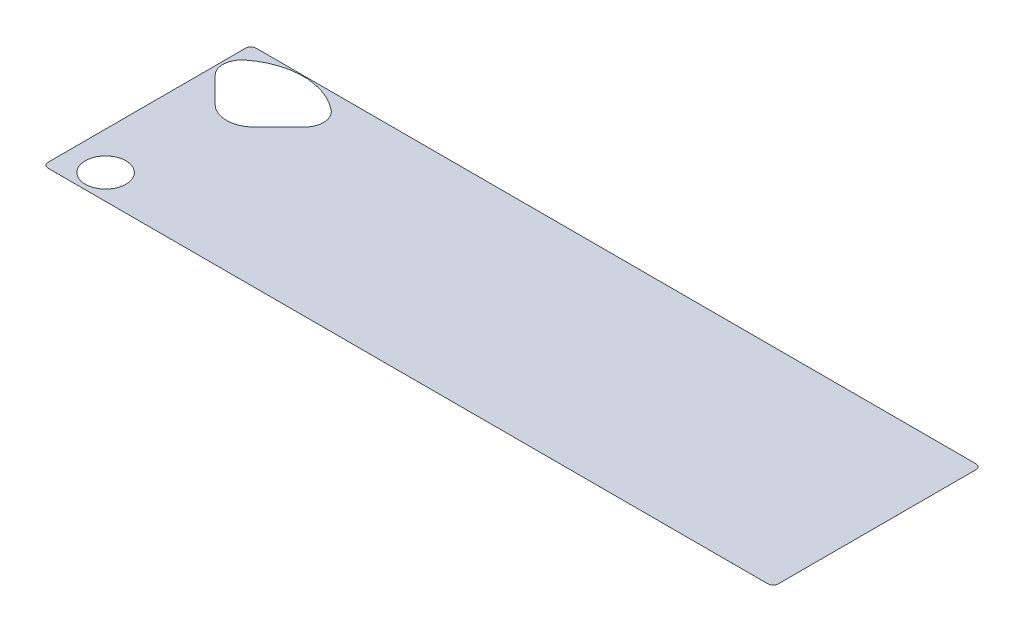
ISO-10303-21;
HEADER;
FILE_DESCRIPTION(('STEP AP214'),'2;1');
FILE_NAME('part.step','',(''),(''),'','','');
FILE_SCHEMA(('AUTOMOTIVE_DESIGN { 1 0 10303 214 1 1 1 1 }'));
ENDSEC;
DATA;
#1=APPLICATION_CONTEXT('core data for automotive mechanical design processes');
#2=APPLICATION_PROTOCOL_DEFINITION('international standard','automotive_design',2000,#1);
#3=PRODUCT_CONTEXT('',#1,'mechanical');
#4=PRODUCT('Part','Part','',(#3));
#5=PRODUCT_RELATED_PRODUCT_CATEGORY('part','',(#4));
#6=PRODUCT_DEFINITION_FORMATION('','',#4);
#7=PRODUCT_DEFINITION_CONTEXT('part definition',#1,'design');
#8=PRODUCT_DEFINITION('design','',#6,#7);
#9=PRODUCT_DEFINITION_SHAPE('','',#8);
#10=(LENGTH_UNIT() NAMED_UNIT(*) SI_UNIT(.MILLI.,.METRE.));
#11=(NAMED_UNIT(*) PLANE_ANGLE_UNIT() SI_UNIT($,.RADIAN.));
#12=(NAMED_UNIT(*) SI_UNIT($,.STERADIAN.) SOLID_ANGLE_UNIT());
#13=UNCERTAINTY_MEASURE_WITH_UNIT(LENGTH_MEASURE(1.E-05),#10,'distance_accuracy_value','');
#14=(GEOMETRIC_REPRESENTATION_CONTEXT(3) GLOBAL_UNCERTAINTY_ASSIGNED_CONTEXT((#13)) GLOBAL_UNIT_ASSIGNED_CONTEXT((#10,
#11,#12)) REPRESENTATION_CONTEXT('',''));
#15=CARTESIAN_POINT('',(0.,0.,0.));
#16=DIRECTION('',(0.,0.,1.));
#17=DIRECTION('',(1.,0.,0.));
#18=AXIS2_PLACEMENT_3D('',#15,#16,#17);
#19=CARTESIAN_POINT('',(-837.635452032068,-122.169,236.036452032068));
#20=DIRECTION('',(0.,-1.,0.));
#21=DIRECTION('',(0.,0.,-1.));
#22=AXIS2_PLACEMENT_3D('',#19,#20,#21);
#23=PLANE('',#22);
#24=DIRECTION('',(0.,0.,1.));
#25=VECTOR('',#24,1.);
#26=CARTESIAN_POINT('',(-841.209630394536,-122.169,-236.036452032068));
#27=LINE('',#26,#25);
#28=CARTESIAN_POINT('',(-841.209630394536,-122.169,-227.338277777606));
#29=VERTEX_POINT('',#28);
#30=CARTESIAN_POINT('',(-841.209630394536,-122.169,227.338277777606));
#31=VERTEX_POINT('',#30);
#32=EDGE_CURVE('E187',#29,#31,#27,.T.);
#33=ORIENTED_EDGE('',*,*,#32,.T.);
#34=CARTESIAN_POINT('',(-841.209630394536,-122.169,227.338277777606));
#35=CARTESIAN_POINT('',(-841.209630394536,-122.169,228.94126290041));
#36=CARTESIAN_POINT('',(-840.578161905761,-122.169,232.191113095237));
#37=CARTESIAN_POINT('',(-837.861109297853,-122.169,236.262109297853));
#38=CARTESIAN_POINT('',(-833.790113095237,-122.169,238.979161905761));
#39=CARTESIAN_POINT('',(-830.540262900411,-122.169,239.610630394536));
#40=CARTESIAN_POINT('',(-828.937277777606,-122.169,239.610630394536));
#41=B_SPLINE_CURVE_WITH_KNOTS('',3,(#34,#35,#36,#37,#38,#39,#40),.UNSPECIFIED.,.F.,.F.,(4,1,1,1,
4),(0.,0.25,0.5,0.75,1.),.UNSPECIFIED.);
#42=CARTESIAN_POINT('',(-828.937277777606,-122.169,239.610630394536));
#43=VERTEX_POINT('',#42);
#44=EDGE_CURVE('E190',#31,#43,#41,.T.);
#45=ORIENTED_EDGE('',*,*,#44,.T.);
#46=DIRECTION('',(1.,0.,0.));
#47=VECTOR('',#46,1.);
#48=CARTESIAN_POINT('',(-837.635452032068,-122.169,239.610630394536));
#49=LINE('',#48,#47);
#50=CARTESIAN_POINT('',(828.937277777606,-122.169,239.610630394536));
#51=VERTEX_POINT('',#50);
#52=EDGE_CURVE('E196',#43,#51,#49,.T.);
#53=ORIENTED_EDGE('',*,*,#52,.T.);
#54=CARTESIAN_POINT('',(828.937277777606,-122.169,239.610630394536));
#55=CARTESIAN_POINT('',(830.54026290041,-122.169,239.610630394536));
#56=CARTESIAN_POINT('',(833.790113095237,-122.169,238.979161905761));
#57=CARTESIAN_POINT('',(837.861109297853,-122.169,236.262109297853));
#58=CARTESIAN_POINT('',(840.57816190576,-122.169,232.191113095237));
#59=CARTESIAN_POINT('',(841.209630394536,-122.169,228.94126290041));
#60=CARTESIAN_POINT('',(841.209630394536,-122.169,227.338277777606));
#61=B_SPLINE_CURVE_WITH_KNOTS('',3,(#54,#55,#56,#57,#58,#59,#60),.UNSPECIFIED.,.F.,.F.,(4,1,1,1,
4),(0.,0.25,0.5,0.75,1.),.UNSPECIFIED.);
#62=CARTESIAN_POINT('',(841.209630394536,-122.169,227.338277777606));
#63=VERTEX_POINT('',#62);
#64=EDGE_CURVE('E215',#51,#63,#61,.T.);
#65=ORIENTED_EDGE('',*,*,#64,.T.);
#66=DIRECTION('',(0.,0.,-1.));
#67=VECTOR('',#66,1.);
#68=CARTESIAN_POINT('',(841.209630394536,-122.169,-236.036452032068));
#69=LINE('',#68,#67);
#70=CARTESIAN_POINT('',(841.209630394536,-122.169,-227.338277777606));
#71=VERTEX_POINT('',#70);
#72=EDGE_CURVE('E220',#63,#71,#69,.T.);
#73=ORIENTED_EDGE('',*,*,#72,.T.);
#74=CARTESIAN_POINT('',(841.209630394536,-122.169,-227.338277777606));
#75=CARTESIAN_POINT('',(841.209630394536,-122.169,-228.94126290041));
#76=CARTESIAN_POINT('',(840.578161905761,-122.169,-232.191113095237));
#77=CARTESIAN_POINT('',(837.861109297853,-122.169,-236.262109297853));
#78=CARTESIAN_POINT('',(833.790113095237,-122.169,-238.979161905761));
#79=CARTESIAN_POINT('',(830.54026290041,-122.169,-239.610630394536));
#80=CARTESIAN_POINT('',(828.937277777606,-122.169,-239.610630394536));
#81=B_SPLINE_CURVE_WITH_KNOTS('',3,(#74,#75,#76,#77,#78,#79,#80),.UNSPECIFIED.,.F.,.F.,(4,1,1,1,
4),(0.,0.25,0.5,0.75,1.),.UNSPECIFIED.);
#82=CARTESIAN_POINT('',(828.937277777606,-122.169,-239.610630394536));
#83=VERTEX_POINT('',#82);
#84=EDGE_CURVE('E225',#71,#83,#81,.T.);
#85=ORIENTED_EDGE('',*,*,#84,.T.);
#86=DIRECTION('',(-1.,0.,0.));
#87=VECTOR('',#86,1.);
#88=CARTESIAN_POINT('',(-837.635452032068,-122.169,-239.610630394536));
#89=LINE('',#88,#87);
#90=CARTESIAN_POINT('',(-828.937277777606,-122.169,-239.610630394536));
#91=VERTEX_POINT('',#90);
#92=EDGE_CURVE('E230',#83,#91,#89,.T.);
#93=ORIENTED_EDGE('',*,*,#92,.T.);
#94=CARTESIAN_POINT('',(-828.937277777606,-122.169,-239.610630394536));
#95=CARTESIAN_POINT('',(-830.54026290041,-122.169,-239.610630394536));
#96=CARTESIAN_POINT('',(-833.790113095237,-122.169,-238.979161905761));
#97=CARTESIAN_POINT('',(-837.861109297853,-122.169,-236.262109297853));
#98=CARTESIAN_POINT('',(-840.57816190576,-122.169,-232.191113095237));
#99=CARTESIAN_POINT('',(-841.209630394536,-122.169,-228.94126290041));
#100=CARTESIAN_POINT('',(-841.209630394536,-122.169,-227.338277777606));
#101=B_SPLINE_CURVE_WITH_KNOTS('',3,(#94,#95,#96,#97,#98,#99,#100),.UNSPECIFIED.,.F.,.F.,(4,1,1,
1,4),(0.,0.25,0.5,0.75,1.),.UNSPECIFIED.);
#102=EDGE_CURVE('E249',#91,#29,#101,.T.);
#103=ORIENTED_EDGE('',*,*,#102,.T.);
#104=EDGE_LOOP('',(#33,#45,#53,#65,#73,#85,#93,#103));
#105=FACE_BOUND('',#104,.T.);
#106=CARTESIAN_POINT('',(-719.067867535307,-122.169,-78.74));
#107=DIRECTION('',(0.,1.,0.));
#108=DIRECTION('',(0.,0.,1.));
#109=AXIS2_PLACEMENT_3D('',#106,#107,#108);
#110=CIRCLE('',#109,159.09718636014);
#111=CARTESIAN_POINT('',(-619.375967050333,-122.169,-202.729675721034));
#112=VERTEX_POINT('',#111);
#113=CARTESIAN_POINT('',(-818.759768020282,-122.169,-202.729675721033));
#114=VERTEX_POINT('',#113);
#115=EDGE_CURVE('E133',#112,#114,#110,.T.);
#116=ORIENTED_EDGE('',*,*,#115,.F.);
#117=CARTESIAN_POINT('',(-646.537750912032,-122.169,-168.947786152938));
#118=DIRECTION('',(0.,1.,0.));
#119=DIRECTION('',(0.,0.,1.));
#120=AXIS2_PLACEMENT_3D('',#117,#118,#119);
#121=CIRCLE('',#120,43.3471863601398);
#122=CARTESIAN_POINT('',(-615.88666149142,-122.169,-138.296696732326));
#123=VERTEX_POINT('',#122);
#124=EDGE_CURVE('E164',#123,#112,#121,.T.);
#125=ORIENTED_EDGE('',*,*,#124,.F.);
#126=DIRECTION('',(0.707106781186546,0.,-0.707106781186549));
#127=VECTOR('',#126,1.);
#128=CARTESIAN_POINT('',(-677.891179111873,-122.169,-76.2921791118735));
#129=LINE('',#128,#127);
#130=CARTESIAN_POINT('',(-674.274642490964,-122.169,-79.9087157327824));
#131=VERTEX_POINT('',#130);
#132=EDGE_CURVE('E162',#131,#123,#129,.T.);
#133=ORIENTED_EDGE('',*,*,#132,.F.);
#134=CARTESIAN_POINT('',(-719.067867535307,-122.169,-124.701940777126));
#135=DIRECTION('',(0.,1.,0.));
#136=DIRECTION('',(0.,0.,1.));
#137=AXIS2_PLACEMENT_3D('',#134,#135,#136);
#138=CIRCLE('',#137,63.3471863601401);
#139=CARTESIAN_POINT('',(-763.86109257965,-122.169,-79.9087157327826));
#140=VERTEX_POINT('',#139);
#141=EDGE_CURVE('E157',#140,#131,#138,.T.);
#142=ORIENTED_EDGE('',*,*,#141,.F.);
#143=DIRECTION('',(0.707106781186548,0.,0.707106781186547));
#144=VECTOR('',#143,1.);
#145=CARTESIAN_POINT('',(-878.812140455502,-122.169,-194.859763608634));
#146=LINE('',#145,#144);
#147=CARTESIAN_POINT('',(-822.249073579193,-122.169,-138.296696732326));
#148=VERTEX_POINT('',#147);
#149=EDGE_CURVE('E155',#148,#140,#146,.T.);
#150=ORIENTED_EDGE('',*,*,#149,.F.);
#151=CARTESIAN_POINT('',(-791.597984158582,-122.169,-168.947786152938));
#152=DIRECTION('',(0.,1.,0.));
#153=DIRECTION('',(0.,0.,1.));
#154=AXIS2_PLACEMENT_3D('',#151,#152,#153);
#155=CIRCLE('',#154,43.3471863601399);
#156=EDGE_CURVE('E141',#114,#148,#155,.T.);
#157=ORIENTED_EDGE('',*,*,#156,.F.);
#158=EDGE_LOOP('',(#116,#125,#133,#142,#150,#157));
#159=FACE_BOUND('',#158,.T.);
#160=CARTESIAN_POINT('',(-754.50638834792,-122.169,181.844577047281));
#161=DIRECTION('',(0.,1.,0.));
#162=DIRECTION('',(0.,0.,1.));
#163=AXIS2_PLACEMENT_3D('',#160,#161,#162);
#164=CIRCLE('',#163,46.83);
#165=CARTESIAN_POINT('',(-754.50638834792,-122.169,135.014577047281));
#166=VERTEX_POINT('',#165);
#167=EDGE_CURVE('E167',#166,#166,#164,.T.);
#168=ORIENTED_EDGE('',*,*,#167,.F.);
#169=EDGE_LOOP('',(#168));
#170=FACE_BOUND('',#169,.T.);
#171=ADVANCED_FACE('F32',(#105,#159,#170),#23,.F.);
#172=CARTESIAN_POINT('',(-837.635452032068,-122.174,236.036452032068));
#173=DIRECTION('',(0.,-1.,0.));
#174=DIRECTION('',(0.,0.,-1.));
#175=AXIS2_PLACEMENT_3D('',#172,#173,#174);
#176=PLANE('',#175);
#177=CARTESIAN_POINT('',(-646.537750912032,-122.174,-168.947786152938));
#178=DIRECTION('',(0.,1.,0.));
#179=DIRECTION('',(0.,0.,1.));
#180=AXIS2_PLACEMENT_3D('',#177,#178,#179);
#181=CIRCLE('',#180,43.3471863601398);
#182=CARTESIAN_POINT('',(-615.88666149142,-122.174,-138.296696732326));
#183=VERTEX_POINT('',#182);
#184=CARTESIAN_POINT('',(-619.375967050333,-122.174,-202.729675721034));
#185=VERTEX_POINT('',#184);
#186=EDGE_CURVE('E142',#183,#185,#181,.T.);
#187=ORIENTED_EDGE('',*,*,#186,.T.);
#188=CARTESIAN_POINT('',(-719.067867535307,-122.174,-78.74));
#189=DIRECTION('',(0.,1.,0.));
#190=DIRECTION('',(0.,0.,1.));
#191=AXIS2_PLACEMENT_3D('',#188,#189,#190);
#192=CIRCLE('',#191,159.09718636014);
#193=CARTESIAN_POINT('',(-818.759768020282,-122.174,-202.729675721033));
#194=VERTEX_POINT('',#193);
#195=EDGE_CURVE('E55',#185,#194,#192,.T.);
#196=ORIENTED_EDGE('',*,*,#195,.T.);
#197=CARTESIAN_POINT('',(-791.597984158582,-122.174,-168.947786152938));
#198=DIRECTION('',(0.,1.,0.));
#199=DIRECTION('',(0.,0.,1.));
#200=AXIS2_PLACEMENT_3D('',#197,#198,#199);
#201=CIRCLE('',#200,43.3471863601399);
#202=CARTESIAN_POINT('',(-822.249073579193,-122.174,-138.296696732326));
#203=VERTEX_POINT('',#202);
#204=EDGE_CURVE('E148',#194,#203,#201,.T.);
#205=ORIENTED_EDGE('',*,*,#204,.T.);
#206=DIRECTION('',(0.707106781186548,0.,0.707106781186547));
#207=VECTOR('',#206,1.);
#208=CARTESIAN_POINT('',(-878.812140455502,-122.174,-194.859763608634));
#209=LINE('',#208,#207);
#210=CARTESIAN_POINT('',(-763.86109257965,-122.174,-79.9087157327826));
#211=VERTEX_POINT('',#210);
#212=EDGE_CURVE('E169',#203,#211,#209,.T.);
#213=ORIENTED_EDGE('',*,*,#212,.T.);
#214=CARTESIAN_POINT('',(-719.067867535307,-122.174,-124.701940777126));
#215=DIRECTION('',(0.,1.,0.));
#216=DIRECTION('',(0.,0.,1.));
#217=AXIS2_PLACEMENT_3D('',#214,#215,#216);
#218=CIRCLE('',#217,63.3471863601401);
#219=CARTESIAN_POINT('',(-674.274642490964,-122.174,-79.9087157327824));
#220=VERTEX_POINT('',#219);
#221=EDGE_CURVE('E172',#211,#220,#218,.T.);
#222=ORIENTED_EDGE('',*,*,#221,.T.);
#223=DIRECTION('',(0.707106781186546,0.,-0.707106781186549));
#224=VECTOR('',#223,1.);
#225=CARTESIAN_POINT('',(-677.891179111873,-122.174,-76.2921791118735));
#226=LINE('',#225,#224);
#227=EDGE_CURVE('E175',#220,#183,#226,.T.);
#228=ORIENTED_EDGE('',*,*,#227,.T.);
#229=EDGE_LOOP('',(#187,#196,#205,#213,#222,#228));
#230=FACE_BOUND('',#229,.T.);
#231=DIRECTION('',(0.,0.,1.));
#232=VECTOR('',#231,1.);
#233=CARTESIAN_POINT('',(-841.209630394536,-122.174,-236.036452032068));
#234=LINE('',#233,#232);
#235=CARTESIAN_POINT('',(-841.209630394536,-122.174,-227.338277777606));
#236=VERTEX_POINT('',#235);
#237=CARTESIAN_POINT('',(-841.209630394536,-122.174,227.338277777606));
#238=VERTEX_POINT('',#237);
#239=EDGE_CURVE('E149',#236,#238,#234,.T.);
#240=ORIENTED_EDGE('',*,*,#239,.F.);
#241=CARTESIAN_POINT('',(-828.937277777606,-122.174,-239.610630394536));
#242=CARTESIAN_POINT('',(-830.54026290041,-122.174,-239.610630394536));
#243=CARTESIAN_POINT('',(-833.790113095237,-122.174,-238.979161905761));
#244=CARTESIAN_POINT('',(-837.861109297853,-122.174,-236.262109297853));
#245=CARTESIAN_POINT('',(-840.57816190576,-122.174,-232.191113095237));
#246=CARTESIAN_POINT('',(-841.209630394536,-122.174,-228.94126290041));
#247=CARTESIAN_POINT('',(-841.209630394536,-122.174,-227.338277777606));
#248=B_SPLINE_CURVE_WITH_KNOTS('',3,(#241,#242,#243,#244,#245,#246,#247),.UNSPECIFIED.,.F.,.F.,
(4,1,1,1,4),(0.,0.25,0.5,0.75,1.),.UNSPECIFIED.);
#249=CARTESIAN_POINT('',(-828.937277777606,-122.174,-239.610630394536));
#250=VERTEX_POINT('',#249);
#251=EDGE_CURVE('E191',#250,#236,#248,.T.);
#252=ORIENTED_EDGE('',*,*,#251,.F.);
#253=DIRECTION('',(-1.,0.,0.));
#254=VECTOR('',#253,1.);
#255=CARTESIAN_POINT('',(-837.635452032068,-122.174,-239.610630394536));
#256=LINE('',#255,#254);
#257=CARTESIAN_POINT('',(828.937277777606,-122.174,-239.610630394536));
#258=VERTEX_POINT('',#257);
#259=EDGE_CURVE('E282',#258,#250,#256,.T.);
#260=ORIENTED_EDGE('',*,*,#259,.F.);
#261=CARTESIAN_POINT('',(841.209630394536,-122.174,-227.338277777606));
#262=CARTESIAN_POINT('',(841.209630394536,-122.174,-228.94126290041));
#263=CARTESIAN_POINT('',(840.578161905761,-122.174,-232.191113095237));
#264=CARTESIAN_POINT('',(837.861109297853,-122.174,-236.262109297853));
#265=CARTESIAN_POINT('',(833.790113095237,-122.174,-238.979161905761));
#266=CARTESIAN_POINT('',(830.54026290041,-122.174,-239.610630394536));
#267=CARTESIAN_POINT('',(828.937277777606,-122.174,-239.610630394536));
#268=B_SPLINE_CURVE_WITH_KNOTS('',3,(#261,#262,#263,#264,#265,#266,#267),.UNSPECIFIED.,.F.,.F.,
(4,1,1,1,4),(0.,0.25,0.5,0.75,1.),.UNSPECIFIED.);
#269=CARTESIAN_POINT('',(841.209630394536,-122.174,-227.338277777606));
#270=VERTEX_POINT('',#269);
#271=EDGE_CURVE('E278',#270,#258,#268,.T.);
#272=ORIENTED_EDGE('',*,*,#271,.F.);
#273=DIRECTION('',(0.,0.,-1.));
#274=VECTOR('',#273,1.);
#275=CARTESIAN_POINT('',(841.209630394536,-122.174,-236.036452032068));
#276=LINE('',#275,#274);
#277=CARTESIAN_POINT('',(841.209630394536,-122.174,227.338277777606));
#278=VERTEX_POINT('',#277);
#279=EDGE_CURVE('E273',#278,#270,#276,.T.);
#280=ORIENTED_EDGE('',*,*,#279,.F.);
#281=CARTESIAN_POINT('',(828.937277777606,-122.174,239.610630394536));
#282=CARTESIAN_POINT('',(830.54026290041,-122.174,239.610630394536));
#283=CARTESIAN_POINT('',(833.790113095237,-122.174,238.979161905761));
#284=CARTESIAN_POINT('',(837.861109297853,-122.174,236.262109297853));
#285=CARTESIAN_POINT('',(840.57816190576,-122.174,232.191113095237));
#286=CARTESIAN_POINT('',(841.209630394536,-122.174,228.94126290041));
#287=CARTESIAN_POINT('',(841.209630394536,-122.174,227.338277777606));
#288=B_SPLINE_CURVE_WITH_KNOTS('',3,(#281,#282,#283,#284,#285,#286,#287),.UNSPECIFIED.,.F.,.F.,
(4,1,1,1,4),(0.,0.25,0.5,0.75,1.),.UNSPECIFIED.);
#289=CARTESIAN_POINT('',(828.937277777606,-122.174,239.610630394536));
#290=VERTEX_POINT('',#289);
#291=EDGE_CURVE('E269',#290,#278,#288,.T.);
#292=ORIENTED_EDGE('',*,*,#291,.F.);
#293=DIRECTION('',(1.,0.,0.));
#294=VECTOR('',#293,1.);
#295=CARTESIAN_POINT('',(-837.635452032068,-122.174,239.610630394536));
#296=LINE('',#295,#294);
#297=CARTESIAN_POINT('',(-828.937277777606,-122.174,239.610630394536));
#298=VERTEX_POINT('',#297);
#299=EDGE_CURVE('E264',#298,#290,#296,.T.);
#300=ORIENTED_EDGE('',*,*,#299,.F.);
#301=CARTESIAN_POINT('',(-841.209630394536,-122.174,227.338277777606));
#302=CARTESIAN_POINT('',(-841.209630394536,-122.174,228.94126290041));
#303=CARTESIAN_POINT('',(-840.578161905761,-122.174,232.191113095237));
#304=CARTESIAN_POINT('',(-837.861109297853,-122.174,236.262109297853));
#305=CARTESIAN_POINT('',(-833.790113095237,-122.174,238.979161905761));
#306=CARTESIAN_POINT('',(-830.540262900411,-122.174,239.610630394536));
#307=CARTESIAN_POINT('',(-828.937277777606,-122.174,239.610630394536));
#308=B_SPLINE_CURVE_WITH_KNOTS('',3,(#301,#302,#303,#304,#305,#306,#307),.UNSPECIFIED.,.F.,.F.,
(4,1,1,1,4),(0.,0.25,0.5,0.75,1.),.UNSPECIFIED.);
#309=EDGE_CURVE('E260',#238,#298,#308,.T.);
#310=ORIENTED_EDGE('',*,*,#309,.F.);
#311=EDGE_LOOP('',(#240,#252,#260,#272,#280,#292,#300,#310));
#312=FACE_BOUND('',#311,.T.);
#313=CARTESIAN_POINT('',(-754.50638834792,-122.174,181.844577047281));
#314=DIRECTION('',(0.,1.,0.));
#315=DIRECTION('',(0.,0.,1.));
#316=AXIS2_PLACEMENT_3D('',#313,#314,#315);
#317=CIRCLE('',#316,46.83);
#318=CARTESIAN_POINT('',(-754.50638834792,-122.174,135.014577047281));
#319=VERTEX_POINT('',#318);
#320=EDGE_CURVE('E375',#319,#319,#317,.T.);
#321=ORIENTED_EDGE('',*,*,#320,.T.);
#322=EDGE_LOOP('',(#321));
#323=FACE_BOUND('',#322,.T.);
#324=ADVANCED_FACE('F247',(#230,#312,#323),#176,.T.);
#325=CARTESIAN_POINT('',(-841.209630394536,-122.169,-236.036452032068));
#326=DIRECTION('',(1.,0.,0.));
#327=DIRECTION('',(0.,0.,-1.));
#328=AXIS2_PLACEMENT_3D('',#325,#326,#327);
#329=PLANE('',#328);
#330=ORIENTED_EDGE('',*,*,#239,.T.);
#331=DIRECTION('',(0.,-1.,0.));
#332=VECTOR('',#331,1.);
#333=CARTESIAN_POINT('',(-841.209630394536,-122.169,227.338277777606));
#334=LINE('',#333,#332);
#335=EDGE_CURVE('E11',#31,#238,#334,.T.);
#336=ORIENTED_EDGE('',*,*,#335,.F.);
#337=ORIENTED_EDGE('',*,*,#32,.F.);
#338=DIRECTION('',(0.,-1.,0.));
#339=VECTOR('',#338,1.);
#340=CARTESIAN_POINT('',(-841.209630394536,-122.169,-227.338277777606));
#341=LINE('',#340,#339);
#342=EDGE_CURVE('E254',#29,#236,#341,.T.);
#343=ORIENTED_EDGE('',*,*,#342,.T.);
#344=EDGE_LOOP('',(#330,#336,#337,#343));
#345=FACE_BOUND('',#344,.T.);
#346=ADVANCED_FACE('F34',(#345),#329,.F.);
#347=DIRECTION('',(0.,-1.,0.));
#348=VECTOR('',#347,1.);
#349=SURFACE_OF_LINEAR_EXTRUSION('',#41,#348);
#350=ORIENTED_EDGE('',*,*,#309,.T.);
#351=DIRECTION('',(0.,-1.,0.));
#352=VECTOR('',#351,1.);
#353=CARTESIAN_POINT('',(-828.937277777606,-122.169,239.610630394536));
#354=LINE('',#353,#352);
#355=EDGE_CURVE('E40',#43,#298,#354,.T.);
#356=ORIENTED_EDGE('',*,*,#355,.F.);
#357=ORIENTED_EDGE('',*,*,#44,.F.);
#358=ORIENTED_EDGE('',*,*,#335,.T.);
#359=EDGE_LOOP('',(#350,#356,#357,#358));
#360=FACE_BOUND('',#359,.T.);
#361=ADVANCED_FACE('F201',(#360),#349,.F.);
#362=CARTESIAN_POINT('',(-837.635452032068,-122.169,239.610630394536));
#363=DIRECTION('',(0.,0.,-1.));
#364=DIRECTION('',(-1.,0.,0.));
#365=AXIS2_PLACEMENT_3D('',#362,#363,#364);
#366=PLANE('',#365);
#367=ORIENTED_EDGE('',*,*,#299,.T.);
#368=DIRECTION('',(0.,-1.,0.));
#369=VECTOR('',#368,1.);
#370=CARTESIAN_POINT('',(828.937277777606,-122.169,239.610630394536));
#371=LINE('',#370,#369);
#372=EDGE_CURVE('E307',#51,#290,#371,.T.);
#373=ORIENTED_EDGE('',*,*,#372,.F.);
#374=ORIENTED_EDGE('',*,*,#52,.F.);
#375=ORIENTED_EDGE('',*,*,#355,.T.);
#376=EDGE_LOOP('',(#367,#373,#374,#375));
#377=FACE_BOUND('',#376,.T.);
#378=ADVANCED_FACE('F204',(#377),#366,.F.);
#379=DIRECTION('',(0.,-1.,0.));
#380=VECTOR('',#379,1.);
#381=SURFACE_OF_LINEAR_EXTRUSION('',#61,#380);
#382=ORIENTED_EDGE('',*,*,#291,.T.);
#383=DIRECTION('',(0.,-1.,0.));
#384=VECTOR('',#383,1.);
#385=CARTESIAN_POINT('',(841.209630394536,-122.169,227.338277777606));
#386=LINE('',#385,#384);
#387=EDGE_CURVE('E304',#63,#278,#386,.T.);
#388=ORIENTED_EDGE('',*,*,#387,.F.);
#389=ORIENTED_EDGE('',*,*,#64,.F.);
#390=ORIENTED_EDGE('',*,*,#372,.T.);
#391=EDGE_LOOP('',(#382,#388,#389,#390));
#392=FACE_BOUND('',#391,.T.);
#393=ADVANCED_FACE('F208',(#392),#381,.F.);
#394=CARTESIAN_POINT('',(841.209630394536,-122.169,-236.036452032068));
#395=DIRECTION('',(-1.,0.,0.));
#396=DIRECTION('',(0.,0.,1.));
#397=AXIS2_PLACEMENT_3D('',#394,#395,#396);
#398=PLANE('',#397);
#399=ORIENTED_EDGE('',*,*,#279,.T.);
#400=DIRECTION('',(0.,-1.,0.));
#401=VECTOR('',#400,1.);
#402=CARTESIAN_POINT('',(841.209630394536,-122.169,-227.338277777606));
#403=LINE('',#402,#401);
#404=EDGE_CURVE('E301',#71,#270,#403,.T.);
#405=ORIENTED_EDGE('',*,*,#404,.F.);
#406=ORIENTED_EDGE('',*,*,#72,.F.);
#407=ORIENTED_EDGE('',*,*,#387,.T.);
#408=EDGE_LOOP('',(#399,#405,#406,#407));
#409=FACE_BOUND('',#408,.T.);
#410=ADVANCED_FACE('F212',(#409),#398,.F.);
#411=DIRECTION('',(0.,-1.,0.));
#412=VECTOR('',#411,1.);
#413=SURFACE_OF_LINEAR_EXTRUSION('',#81,#412);
#414=ORIENTED_EDGE('',*,*,#271,.T.);
#415=DIRECTION('',(0.,-1.,0.));
#416=VECTOR('',#415,1.);
#417=CARTESIAN_POINT('',(828.937277777606,-122.169,-239.610630394536));
#418=LINE('',#417,#416);
#419=EDGE_CURVE('E298',#83,#258,#418,.T.);
#420=ORIENTED_EDGE('',*,*,#419,.F.);
#421=ORIENTED_EDGE('',*,*,#84,.F.);
#422=ORIENTED_EDGE('',*,*,#404,.T.);
#423=EDGE_LOOP('',(#414,#420,#421,#422));
#424=FACE_BOUND('',#423,.T.);
#425=ADVANCED_FACE('F235',(#424),#413,.F.);
#426=CARTESIAN_POINT('',(-837.635452032068,-122.169,-239.610630394536));
#427=DIRECTION('',(0.,0.,1.));
#428=DIRECTION('',(1.,0.,0.));
#429=AXIS2_PLACEMENT_3D('',#426,#427,#428);
#430=PLANE('',#429);
#431=ORIENTED_EDGE('',*,*,#259,.T.);
#432=DIRECTION('',(0.,-1.,0.));
#433=VECTOR('',#432,1.);
#434=CARTESIAN_POINT('',(-828.937277777606,-122.169,-239.610630394536));
#435=LINE('',#434,#433);
#436=EDGE_CURVE('E295',#91,#250,#435,.T.);
#437=ORIENTED_EDGE('',*,*,#436,.F.);
#438=ORIENTED_EDGE('',*,*,#92,.F.);
#439=ORIENTED_EDGE('',*,*,#419,.T.);
#440=EDGE_LOOP('',(#431,#437,#438,#439));
#441=FACE_BOUND('',#440,.T.);
#442=ADVANCED_FACE('F238',(#441),#430,.F.);
#443=DIRECTION('',(0.,-1.,0.));
#444=VECTOR('',#443,1.);
#445=SURFACE_OF_LINEAR_EXTRUSION('',#101,#444);
#446=ORIENTED_EDGE('',*,*,#251,.T.);
#447=ORIENTED_EDGE('',*,*,#342,.F.);
#448=ORIENTED_EDGE('',*,*,#102,.F.);
#449=ORIENTED_EDGE('',*,*,#436,.T.);
#450=EDGE_LOOP('',(#446,#447,#448,#449));
#451=FACE_BOUND('',#450,.T.);
#452=ADVANCED_FACE('F242',(#451),#445,.F.);
#453=CARTESIAN_POINT('',(-719.067867535307,-122.169,-78.74));
#454=DIRECTION('',(0.,-1.,0.));
#455=DIRECTION('',(0.,0.,-1.));
#456=AXIS2_PLACEMENT_3D('',#453,#454,#455);
#457=CYLINDRICAL_SURFACE('',#456,159.09718636014);
#458=ORIENTED_EDGE('',*,*,#195,.F.);
#459=DIRECTION('',(0.,-1.,0.));
#460=VECTOR('',#459,1.);
#461=CARTESIAN_POINT('',(-619.375967050333,-122.169,-202.729675721034));
#462=LINE('',#461,#460);
#463=EDGE_CURVE('E137',#112,#185,#462,.T.);
#464=ORIENTED_EDGE('',*,*,#463,.F.);
#465=ORIENTED_EDGE('',*,*,#115,.T.);
#466=DIRECTION('',(0.,-1.,0.));
#467=VECTOR('',#466,1.);
#468=CARTESIAN_POINT('',(-818.759768020282,-122.169,-202.729675721033));
#469=LINE('',#468,#467);
#470=EDGE_CURVE('E136',#114,#194,#469,.T.);
#471=ORIENTED_EDGE('',*,*,#470,.T.);
#472=EDGE_LOOP('',(#458,#464,#465,#471));
#473=FACE_BOUND('',#472,.T.);
#474=ADVANCED_FACE('F135',(#473),#457,.F.);
#475=CARTESIAN_POINT('',(-791.597984158582,-122.169,-168.947786152938));
#476=DIRECTION('',(0.,-1.,0.));
#477=DIRECTION('',(0.,0.,-1.));
#478=AXIS2_PLACEMENT_3D('',#475,#476,#477);
#479=CYLINDRICAL_SURFACE('',#478,43.3471863601399);
#480=ORIENTED_EDGE('',*,*,#204,.F.);
#481=ORIENTED_EDGE('',*,*,#470,.F.);
#482=ORIENTED_EDGE('',*,*,#156,.T.);
#483=DIRECTION('',(0.,-1.,0.));
#484=VECTOR('',#483,1.);
#485=CARTESIAN_POINT('',(-822.249073579193,-122.169,-138.296696732326));
#486=LINE('',#485,#484);
#487=EDGE_CURVE('E150',#148,#203,#486,.T.);
#488=ORIENTED_EDGE('',*,*,#487,.T.);
#489=EDGE_LOOP('',(#480,#481,#482,#488));
#490=FACE_BOUND('',#489,.T.);
#491=ADVANCED_FACE('F145',(#490),#479,.F.);
#492=CARTESIAN_POINT('',(-878.812140455502,-122.169,-194.859763608634));
#493=DIRECTION('',(0.707106781186547,0.,-0.707106781186548));
#494=DIRECTION('',(-0.707106781186548,0.,-0.707106781186547));
#495=AXIS2_PLACEMENT_3D('',#492,#493,#494);
#496=PLANE('',#495);
#497=ORIENTED_EDGE('',*,*,#212,.F.);
#498=ORIENTED_EDGE('',*,*,#487,.F.);
#499=ORIENTED_EDGE('',*,*,#149,.T.);
#500=DIRECTION('',(0.,-1.,0.));
#501=VECTOR('',#500,1.);
#502=CARTESIAN_POINT('',(-763.86109257965,-122.169,-79.9087157327826));
#503=LINE('',#502,#501);
#504=EDGE_CURVE('E184',#140,#211,#503,.T.);
#505=ORIENTED_EDGE('',*,*,#504,.T.);
#506=EDGE_LOOP('',(#497,#498,#499,#505));
#507=FACE_BOUND('',#506,.T.);
#508=ADVANCED_FACE('F350',(#507),#496,.T.);
#509=CARTESIAN_POINT('',(-719.067867535307,-122.169,-124.701940777126));
#510=DIRECTION('',(0.,-1.,0.));
#511=DIRECTION('',(0.,0.,-1.));
#512=AXIS2_PLACEMENT_3D('',#509,#510,#511);
#513=CYLINDRICAL_SURFACE('',#512,63.3471863601401);
#514=ORIENTED_EDGE('',*,*,#221,.F.);
#515=ORIENTED_EDGE('',*,*,#504,.F.);
#516=ORIENTED_EDGE('',*,*,#141,.T.);
#517=DIRECTION('',(0.,-1.,0.));
#518=VECTOR('',#517,1.);
#519=CARTESIAN_POINT('',(-674.274642490964,-122.169,-79.9087157327824));
#520=LINE('',#519,#518);
#521=EDGE_CURVE('E182',#131,#220,#520,.T.);
#522=ORIENTED_EDGE('',*,*,#521,.T.);
#523=EDGE_LOOP('',(#514,#515,#516,#522));
#524=FACE_BOUND('',#523,.T.);
#525=ADVANCED_FACE('F353',(#524),#513,.F.);
#526=CARTESIAN_POINT('',(-677.891179111873,-122.169,-76.2921791118735));
#527=DIRECTION('',(-0.707106781186549,0.,-0.707106781186546));
#528=DIRECTION('',(-0.707106781186546,0.,0.707106781186549));
#529=AXIS2_PLACEMENT_3D('',#526,#527,#528);
#530=PLANE('',#529);
#531=ORIENTED_EDGE('',*,*,#227,.F.);
#532=ORIENTED_EDGE('',*,*,#521,.F.);
#533=ORIENTED_EDGE('',*,*,#132,.T.);
#534=DIRECTION('',(0.,-1.,0.));
#535=VECTOR('',#534,1.);
#536=CARTESIAN_POINT('',(-615.88666149142,-122.169,-138.296696732326));
#537=LINE('',#536,#535);
#538=EDGE_CURVE('E47',#123,#183,#537,.T.);
#539=ORIENTED_EDGE('',*,*,#538,.T.);
#540=EDGE_LOOP('',(#531,#532,#533,#539));
#541=FACE_BOUND('',#540,.T.);
#542=ADVANCED_FACE('F357',(#541),#530,.T.);
#543=CARTESIAN_POINT('',(-646.537750912032,-122.169,-168.947786152938));
#544=DIRECTION('',(0.,-1.,0.));
#545=DIRECTION('',(0.,0.,-1.));
#546=AXIS2_PLACEMENT_3D('',#543,#544,#545);
#547=CYLINDRICAL_SURFACE('',#546,43.3471863601398);
#548=ORIENTED_EDGE('',*,*,#186,.F.);
#549=ORIENTED_EDGE('',*,*,#538,.F.);
#550=ORIENTED_EDGE('',*,*,#124,.T.);
#551=ORIENTED_EDGE('',*,*,#463,.T.);
#552=EDGE_LOOP('',(#548,#549,#550,#551));
#553=FACE_BOUND('',#552,.T.);
#554=ADVANCED_FACE('F361',(#553),#547,.F.);
#555=CARTESIAN_POINT('',(-754.50638834792,-122.169,181.844577047281));
#556=DIRECTION('',(0.,-1.,0.));
#557=DIRECTION('',(0.,0.,-1.));
#558=AXIS2_PLACEMENT_3D('',#555,#556,#557);
#559=CYLINDRICAL_SURFACE('',#558,46.83);
#560=CARTESIAN_POINT('',(-754.50638834792,-122.169,135.014577047281));
#561=CARTESIAN_POINT('',(-754.50638834792,-122.169052083333,135.014577047281));
#562=CARTESIAN_POINT('',(-754.50638834792,-122.169104166667,135.014577047281));
#563=CARTESIAN_POINT('',(-754.50638834792,-122.169208333333,135.014577047281));
#564=CARTESIAN_POINT('',(-754.50638834792,-122.169260416667,135.014577047281));
#565=CARTESIAN_POINT('',(-754.50638834792,-122.169364583333,135.014577047281));
#566=CARTESIAN_POINT('',(-754.50638834792,-122.169416666667,135.014577047281));
#567=CARTESIAN_POINT('',(-754.50638834792,-122.169520833333,135.014577047281));
#568=CARTESIAN_POINT('',(-754.50638834792,-122.169572916667,135.014577047281));
#569=CARTESIAN_POINT('',(-754.50638834792,-122.169677083333,135.014577047281));
#570=CARTESIAN_POINT('',(-754.50638834792,-122.169729166667,135.014577047281));
#571=CARTESIAN_POINT('',(-754.50638834792,-122.169833333333,135.014577047281));
#572=CARTESIAN_POINT('',(-754.50638834792,-122.169885416667,135.014577047281));
#573=CARTESIAN_POINT('',(-754.50638834792,-122.169989583333,135.014577047281));
#574=CARTESIAN_POINT('',(-754.50638834792,-122.170041666667,135.014577047281));
#575=CARTESIAN_POINT('',(-754.50638834792,-122.170145833333,135.014577047281));
#576=CARTESIAN_POINT('',(-754.50638834792,-122.170197916667,135.014577047281));
#577=CARTESIAN_POINT('',(-754.50638834792,-122.170302083333,135.014577047281));
#578=CARTESIAN_POINT('',(-754.50638834792,-122.170354166667,135.014577047281));
#579=CARTESIAN_POINT('',(-754.50638834792,-122.170458333333,135.014577047281));
#580=CARTESIAN_POINT('',(-754.50638834792,-122.170510416667,135.014577047281));
#581=CARTESIAN_POINT('',(-754.50638834792,-122.170614583333,135.014577047281));
#582=CARTESIAN_POINT('',(-754.50638834792,-122.170666666667,135.014577047281));
#583=CARTESIAN_POINT('',(-754.50638834792,-122.170770833333,135.014577047281));
#584=CARTESIAN_POINT('',(-754.50638834792,-122.170822916667,135.014577047281));
#585=CARTESIAN_POINT('',(-754.50638834792,-122.170927083333,135.014577047281));
#586=CARTESIAN_POINT('',(-754.50638834792,-122.170979166667,135.014577047281));
#587=CARTESIAN_POINT('',(-754.50638834792,-122.171083333333,135.014577047281));
#588=CARTESIAN_POINT('',(-754.50638834792,-122.171135416667,135.014577047281));
#589=CARTESIAN_POINT('',(-754.50638834792,-122.171239583333,135.014577047281));
#590=CARTESIAN_POINT('',(-754.50638834792,-122.171291666667,135.014577047281));
#591=CARTESIAN_POINT('',(-754.50638834792,-122.171395833333,135.014577047281));
#592=CARTESIAN_POINT('',(-754.50638834792,-122.171447916667,135.014577047281));
#593=CARTESIAN_POINT('',(-754.50638834792,-122.171552083333,135.014577047281));
#594=CARTESIAN_POINT('',(-754.50638834792,-122.171604166667,135.014577047281));
#595=CARTESIAN_POINT('',(-754.50638834792,-122.171708333333,135.014577047281));
#596=CARTESIAN_POINT('',(-754.50638834792,-122.171760416667,135.014577047281));
#597=CARTESIAN_POINT('',(-754.50638834792,-122.171864583333,135.014577047281));
#598=CARTESIAN_POINT('',(-754.50638834792,-122.171916666667,135.014577047281));
#599=CARTESIAN_POINT('',(-754.50638834792,-122.172020833333,135.014577047281));
#600=CARTESIAN_POINT('',(-754.50638834792,-122.172072916667,135.014577047281));
#601=CARTESIAN_POINT('',(-754.50638834792,-122.172177083333,135.014577047281));
#602=CARTESIAN_POINT('',(-754.50638834792,-122.172229166667,135.014577047281));
#603=CARTESIAN_POINT('',(-754.50638834792,-122.172333333333,135.014577047281));
#604=CARTESIAN_POINT('',(-754.50638834792,-122.172385416667,135.014577047281));
#605=CARTESIAN_POINT('',(-754.50638834792,-122.172489583333,135.014577047281));
#606=CARTESIAN_POINT('',(-754.50638834792,-122.172541666667,135.014577047281));
#607=CARTESIAN_POINT('',(-754.50638834792,-122.172645833333,135.014577047281));
#608=CARTESIAN_POINT('',(-754.50638834792,-122.172697916667,135.014577047281));
#609=CARTESIAN_POINT('',(-754.50638834792,-122.172802083333,135.014577047281));
#610=CARTESIAN_POINT('',(-754.50638834792,-122.172854166667,135.014577047281));
#611=CARTESIAN_POINT('',(-754.50638834792,-122.172958333333,135.014577047281));
#612=CARTESIAN_POINT('',(-754.50638834792,-122.173010416667,135.014577047281));
#613=CARTESIAN_POINT('',(-754.50638834792,-122.173114583333,135.014577047281));
#614=CARTESIAN_POINT('',(-754.50638834792,-122.173166666667,135.014577047281));
#615=CARTESIAN_POINT('',(-754.50638834792,-122.173270833333,135.014577047281));
#616=CARTESIAN_POINT('',(-754.50638834792,-122.173322916667,135.014577047281));
#617=CARTESIAN_POINT('',(-754.50638834792,-122.173427083333,135.014577047281));
#618=CARTESIAN_POINT('',(-754.50638834792,-122.173479166667,135.014577047281));
#619=CARTESIAN_POINT('',(-754.50638834792,-122.173583333333,135.014577047281));
#620=CARTESIAN_POINT('',(-754.50638834792,-122.173635416667,135.014577047281));
#621=CARTESIAN_POINT('',(-754.50638834792,-122.173739583333,135.014577047281));
#622=CARTESIAN_POINT('',(-754.50638834792,-122.173791666667,135.014577047281));
#623=CARTESIAN_POINT('',(-754.50638834792,-122.173895833333,135.014577047281));
#624=CARTESIAN_POINT('',(-754.50638834792,-122.173947916667,135.014577047281));
#625=CARTESIAN_POINT('',(-754.50638834792,-122.174,135.014577047281));
#626=B_SPLINE_CURVE_WITH_KNOTS('',3,(#560,#561,#562,#563,#564,#565,#566,#567,#568,#569,#570,
#571,#572,#573,#574,#575,#576,#577,#578,#579,#580,#581,#582,#583,#584,#585,#586,#587,#588,#589,
#590,#591,#592,#593,#594,#595,#596,#597,#598,#599,#600,#601,#602,#603,#604,#605,#606,#607,#608,
#609,#610,#611,#612,#613,#614,#615,#616,#617,#618,#619,#620,#621,#622,#623,#624,#625),
.UNSPECIFIED.,.F.,.F.,(4,2,2,2,2,2,2,2,2,2,2,2,2,2,2,2,2,2,2,2,2,2,2,2,2,2,2,2,2,2,2,2,4),(0.,
0.000156249999994085,0.000312499999988169,0.000468749999996132,0.000624999999990217,
0.000781249999998179,0.000937499999992264,0.00109375000000023,0.00124999999999431,
0.0014062499999884,0.00156249999999636,0.00171874999999044,0.00187499999999841,
0.00203124999999249,0.00218750000000045,0.00234374999999454,0.0025000000000025,
0.00265624999999658,0.00281249999999067,0.00296874999999863,0.00312499999999272,
0.00328125000000068,0.00343749999999476,0.00359375000000273,0.00374999999999681,
0.0039062499999909,0.00406249999999886,0.00421874999999294,0.00437500000000091,
0.00453124999999499,0.00468750000000295,0.00484374999999704,0.005000000000005),.UNSPECIFIED.);
#627=EDGE_CURVE('BSEAM365',#166,#319,#626,.T.);
#628=ORIENTED_EDGE('',*,*,#167,.T.);
#629=ORIENTED_EDGE('',*,*,#320,.F.);
#630=ORIENTED_EDGE('',*,*,#627,.T.);
#631=ORIENTED_EDGE('',*,*,#627,.F.);
#632=EDGE_LOOP('',(#628,#630,#629,#631));
#633=FACE_BOUND('',#632,.T.);
#634=ADVANCED_FACE('F365',(#633),#559,.F.);
#635=CLOSED_SHELL('',(#171,#324,#346,#361,#378,#393,#410,#425,#442,#452,#474,#491,#508,#525,
#542,#554,#634));
#636=MANIFOLD_SOLID_BREP('B2',#635);
#637=ADVANCED_BREP_SHAPE_REPRESENTATION('',(#18,#636),#14);
#638=SHAPE_DEFINITION_REPRESENTATION(#9,#637);
ENDSEC;
END-ISO-10303-21;
